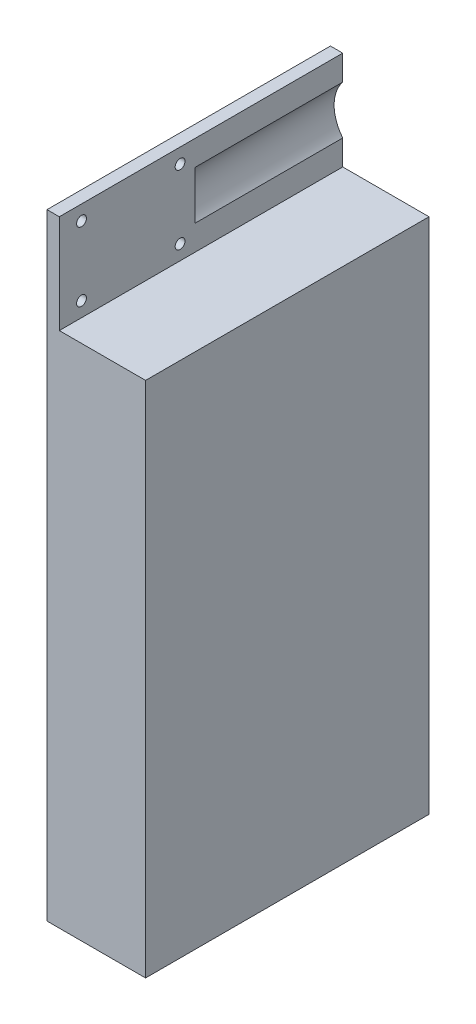
ISO-10303-21;
HEADER;
FILE_DESCRIPTION(('STEP AP214'),'2;1');
FILE_NAME('part.step','',(''),(''),'','','');
FILE_SCHEMA(('AUTOMOTIVE_DESIGN { 1 0 10303 214 1 1 1 1 }'));
ENDSEC;
DATA;
#1=APPLICATION_CONTEXT('core data for automotive mechanical design processes');
#2=APPLICATION_PROTOCOL_DEFINITION('international standard','automotive_design',2000,#1);
#3=PRODUCT_CONTEXT('',#1,'mechanical');
#4=PRODUCT('Part','Part','',(#3));
#5=PRODUCT_RELATED_PRODUCT_CATEGORY('part','',(#4));
#6=PRODUCT_DEFINITION_FORMATION('','',#4);
#7=PRODUCT_DEFINITION_CONTEXT('part definition',#1,'design');
#8=PRODUCT_DEFINITION('design','',#6,#7);
#9=PRODUCT_DEFINITION_SHAPE('','',#8);
#10=(LENGTH_UNIT() NAMED_UNIT(*) SI_UNIT(.MILLI.,.METRE.));
#11=(NAMED_UNIT(*) PLANE_ANGLE_UNIT() SI_UNIT($,.RADIAN.));
#12=(NAMED_UNIT(*) SI_UNIT($,.STERADIAN.) SOLID_ANGLE_UNIT());
#13=UNCERTAINTY_MEASURE_WITH_UNIT(LENGTH_MEASURE(1.E-05),#10,'distance_accuracy_value','');
#14=(GEOMETRIC_REPRESENTATION_CONTEXT(3) GLOBAL_UNCERTAINTY_ASSIGNED_CONTEXT((#13)) GLOBAL_UNIT_ASSIGNED_CONTEXT((#10,
#11,#12)) REPRESENTATION_CONTEXT('',''));
#15=CARTESIAN_POINT('',(0.,0.,0.));
#16=DIRECTION('',(0.,0.,1.));
#17=DIRECTION('',(1.,0.,0.));
#18=AXIS2_PLACEMENT_3D('',#15,#16,#17);
#19=CARTESIAN_POINT('',(0.,0.,115.));
#20=DIRECTION('',(0.,-1.,0.));
#21=DIRECTION('',(0.,0.,-1.));
#22=AXIS2_PLACEMENT_3D('',#19,#20,#21);
#23=PLANE('',#22);
#24=DIRECTION('',(-1.,0.,0.));
#25=VECTOR('',#24,1.);
#26=CARTESIAN_POINT('',(0.,0.,0.));
#27=LINE('',#26,#25);
#28=CARTESIAN_POINT('',(35.,0.,0.));
#29=VERTEX_POINT('',#28);
#30=CARTESIAN_POINT('',(0.,0.,0.));
#31=VERTEX_POINT('',#30);
#32=EDGE_CURVE('E139',#29,#31,#27,.T.);
#33=ORIENTED_EDGE('',*,*,#32,.T.);
#34=DIRECTION('',(0.,0.,-1.));
#35=VECTOR('',#34,1.);
#36=CARTESIAN_POINT('',(0.,0.,115.));
#37=LINE('',#36,#35);
#38=CARTESIAN_POINT('',(0.,0.,115.));
#39=VERTEX_POINT('',#38);
#40=EDGE_CURVE('E170',#39,#31,#37,.T.);
#41=ORIENTED_EDGE('',*,*,#40,.F.);
#42=DIRECTION('',(-1.,0.,0.));
#43=VECTOR('',#42,1.);
#44=CARTESIAN_POINT('',(0.,0.,115.));
#45=LINE('',#44,#43);
#46=CARTESIAN_POINT('',(35.,0.,115.));
#47=VERTEX_POINT('',#46);
#48=EDGE_CURVE('E159',#47,#39,#45,.T.);
#49=ORIENTED_EDGE('',*,*,#48,.F.);
#50=DIRECTION('',(0.,0.,-1.));
#51=VECTOR('',#50,1.);
#52=CARTESIAN_POINT('',(35.,0.,115.));
#53=LINE('',#52,#51);
#54=EDGE_CURVE('E135',#47,#29,#53,.T.);
#55=ORIENTED_EDGE('',*,*,#54,.T.);
#56=EDGE_LOOP('',(#33,#41,#49,#55));
#57=FACE_BOUND('',#56,.T.);
#58=ADVANCED_FACE('F38',(#57),#23,.F.);
#59=CARTESIAN_POINT('',(0.,0.,115.));
#60=DIRECTION('',(-1.,0.,0.));
#61=DIRECTION('',(0.,0.,1.));
#62=AXIS2_PLACEMENT_3D('',#59,#60,#61);
#63=PLANE('',#62);
#64=CARTESIAN_POINT('',(0.,34.,106.));
#65=DIRECTION('',(-1.,0.,0.));
#66=DIRECTION('',(0.,0.,1.));
#67=AXIS2_PLACEMENT_3D('',#64,#65,#66);
#68=CIRCLE('',#67,2.);
#69=CARTESIAN_POINT('',(0.,34.,108.));
#70=VERTEX_POINT('',#69);
#71=EDGE_CURVE('E144',#70,#70,#68,.T.);
#72=ORIENTED_EDGE('',*,*,#71,.T.);
#73=EDGE_LOOP('',(#72));
#74=FACE_BOUND('',#73,.T.);
#75=CARTESIAN_POINT('',(0.,6.00000000000002,66.));
#76=DIRECTION('',(-1.,0.,0.));
#77=DIRECTION('',(0.,0.,1.));
#78=AXIS2_PLACEMENT_3D('',#75,#76,#77);
#79=CIRCLE('',#78,2.);
#80=CARTESIAN_POINT('',(0.,6.00000000000002,68.));
#81=VERTEX_POINT('',#80);
#82=EDGE_CURVE('E196',#81,#81,#79,.T.);
#83=ORIENTED_EDGE('',*,*,#82,.T.);
#84=EDGE_LOOP('',(#83));
#85=FACE_BOUND('',#84,.T.);
#86=CARTESIAN_POINT('',(0.,6.00000000000001,106.));
#87=DIRECTION('',(-1.,0.,0.));
#88=DIRECTION('',(0.,0.,1.));
#89=AXIS2_PLACEMENT_3D('',#86,#87,#88);
#90=CIRCLE('',#89,2.);
#91=CARTESIAN_POINT('',(0.,6.00000000000001,108.));
#92=VERTEX_POINT('',#91);
#93=EDGE_CURVE('E200',#92,#92,#90,.T.);
#94=ORIENTED_EDGE('',*,*,#93,.T.);
#95=EDGE_LOOP('',(#94));
#96=FACE_BOUND('',#95,.T.);
#97=CARTESIAN_POINT('',(0.,34.,66.));
#98=DIRECTION('',(-1.,0.,0.));
#99=DIRECTION('',(0.,0.,1.));
#100=AXIS2_PLACEMENT_3D('',#97,#98,#99);
#101=CIRCLE('',#100,2.);
#102=CARTESIAN_POINT('',(0.,34.,68.));
#103=VERTEX_POINT('',#102);
#104=EDGE_CURVE('E204',#103,#103,#101,.T.);
#105=ORIENTED_EDGE('',*,*,#104,.T.);
#106=EDGE_LOOP('',(#105));
#107=FACE_BOUND('',#106,.T.);
#108=DIRECTION('',(0.,-1.,0.));
#109=VECTOR('',#108,1.);
#110=CARTESIAN_POINT('',(0.,0.,60.));
#111=LINE('',#110,#109);
#112=CARTESIAN_POINT('',(0.,29.8107084351743,60.));
#113=VERTEX_POINT('',#112);
#114=CARTESIAN_POINT('',(0.,10.1892915648257,60.));
#115=VERTEX_POINT('',#114);
#116=EDGE_CURVE('E11',#113,#115,#111,.T.);
#117=ORIENTED_EDGE('',*,*,#116,.F.);
#118=DIRECTION('',(0.,0.,-1.));
#119=VECTOR('',#118,1.);
#120=CARTESIAN_POINT('',(0.,29.8107084351743,60.));
#121=LINE('',#120,#119);
#122=CARTESIAN_POINT('',(0.,29.8107084351743,0.));
#123=VERTEX_POINT('',#122);
#124=EDGE_CURVE('E224',#113,#123,#121,.T.);
#125=ORIENTED_EDGE('',*,*,#124,.T.);
#126=DIRECTION('',(0.,1.,0.));
#127=VECTOR('',#126,1.);
#128=CARTESIAN_POINT('',(0.,0.,0.));
#129=LINE('',#128,#127);
#130=CARTESIAN_POINT('',(0.,40.,0.));
#131=VERTEX_POINT('',#130);
#132=EDGE_CURVE('E143',#123,#131,#129,.T.);
#133=ORIENTED_EDGE('',*,*,#132,.T.);
#134=DIRECTION('',(0.,0.,-1.));
#135=VECTOR('',#134,1.);
#136=CARTESIAN_POINT('',(0.,40.,115.));
#137=LINE('',#136,#135);
#138=CARTESIAN_POINT('',(0.,40.,115.));
#139=VERTEX_POINT('',#138);
#140=EDGE_CURVE('E166',#139,#131,#137,.T.);
#141=ORIENTED_EDGE('',*,*,#140,.F.);
#142=DIRECTION('',(0.,1.,0.));
#143=VECTOR('',#142,1.);
#144=CARTESIAN_POINT('',(0.,0.,115.));
#145=LINE('',#144,#143);
#146=EDGE_CURVE('E98',#39,#139,#145,.T.);
#147=ORIENTED_EDGE('',*,*,#146,.F.);
#148=ORIENTED_EDGE('',*,*,#40,.T.);
#149=CARTESIAN_POINT('',(0.,10.1892915648257,0.));
#150=VERTEX_POINT('',#149);
#151=EDGE_CURVE('E145',#31,#150,#129,.T.);
#152=ORIENTED_EDGE('',*,*,#151,.T.);
#153=DIRECTION('',(0.,0.,-1.));
#154=VECTOR('',#153,1.);
#155=CARTESIAN_POINT('',(0.,10.1892915648257,60.));
#156=LINE('',#155,#154);
#157=EDGE_CURVE('E53',#150,#115,#156,.F.);
#158=ORIENTED_EDGE('',*,*,#157,.T.);
#159=EDGE_LOOP('',(#117,#125,#133,#141,#147,#148,#152,#158));
#160=FACE_BOUND('',#159,.T.);
#161=ADVANCED_FACE('F181',(#74,#85,#96,#107,#160),#63,.F.);
#162=CARTESIAN_POINT('',(0.,40.,115.));
#163=DIRECTION('',(0.,-1.,0.));
#164=DIRECTION('',(0.,0.,-1.));
#165=AXIS2_PLACEMENT_3D('',#162,#163,#164);
#166=PLANE('',#165);
#167=DIRECTION('',(-1.,0.,0.));
#168=VECTOR('',#167,1.);
#169=CARTESIAN_POINT('',(0.,40.,0.));
#170=LINE('',#169,#168);
#171=CARTESIAN_POINT('',(-5.,40.,0.));
#172=VERTEX_POINT('',#171);
#173=EDGE_CURVE('E149',#131,#172,#170,.T.);
#174=ORIENTED_EDGE('',*,*,#173,.T.);
#175=DIRECTION('',(0.,0.,-1.));
#176=VECTOR('',#175,1.);
#177=CARTESIAN_POINT('',(-5.,40.,115.));
#178=LINE('',#177,#176);
#179=CARTESIAN_POINT('',(-5.,40.,115.));
#180=VERTEX_POINT('',#179);
#181=EDGE_CURVE('E128',#180,#172,#178,.T.);
#182=ORIENTED_EDGE('',*,*,#181,.F.);
#183=DIRECTION('',(-1.,0.,0.));
#184=VECTOR('',#183,1.);
#185=CARTESIAN_POINT('',(0.,40.,115.));
#186=LINE('',#185,#184);
#187=EDGE_CURVE('E114',#139,#180,#186,.T.);
#188=ORIENTED_EDGE('',*,*,#187,.F.);
#189=ORIENTED_EDGE('',*,*,#140,.T.);
#190=EDGE_LOOP('',(#174,#182,#188,#189));
#191=FACE_BOUND('',#190,.T.);
#192=ADVANCED_FACE('F250',(#191),#166,.F.);
#193=CARTESIAN_POINT('',(-5.,40.,115.));
#194=DIRECTION('',(1.,0.,0.));
#195=DIRECTION('',(0.,1.,0.));
#196=AXIS2_PLACEMENT_3D('',#193,#194,#195);
#197=PLANE('',#196);
#198=CARTESIAN_POINT('',(-5.,34.,106.));
#199=DIRECTION('',(-1.,0.,0.));
#200=DIRECTION('',(0.,-1.,0.));
#201=AXIS2_PLACEMENT_3D('',#198,#199,#200);
#202=CIRCLE('',#201,2.);
#203=CARTESIAN_POINT('',(-5.,32.,106.));
#204=VERTEX_POINT('',#203);
#205=EDGE_CURVE('E212',#204,#204,#202,.T.);
#206=ORIENTED_EDGE('',*,*,#205,.F.);
#207=EDGE_LOOP('',(#206));
#208=FACE_BOUND('',#207,.T.);
#209=CARTESIAN_POINT('',(-5.,6.00000000000002,66.));
#210=DIRECTION('',(-1.,0.,0.));
#211=DIRECTION('',(0.,1.,0.));
#212=AXIS2_PLACEMENT_3D('',#209,#210,#211);
#213=CIRCLE('',#212,2.);
#214=CARTESIAN_POINT('',(-5.,8.00000000000001,66.));
#215=VERTEX_POINT('',#214);
#216=EDGE_CURVE('E213',#215,#215,#213,.T.);
#217=ORIENTED_EDGE('',*,*,#216,.F.);
#218=EDGE_LOOP('',(#217));
#219=FACE_BOUND('',#218,.T.);
#220=CARTESIAN_POINT('',(-5.,6.,106.));
#221=DIRECTION('',(-1.,0.,0.));
#222=DIRECTION('',(0.,1.,0.));
#223=AXIS2_PLACEMENT_3D('',#220,#221,#222);
#224=CIRCLE('',#223,2.);
#225=CARTESIAN_POINT('',(-5.,8.,106.));
#226=VERTEX_POINT('',#225);
#227=EDGE_CURVE('E217',#226,#226,#224,.T.);
#228=ORIENTED_EDGE('',*,*,#227,.F.);
#229=EDGE_LOOP('',(#228));
#230=FACE_BOUND('',#229,.T.);
#231=CARTESIAN_POINT('',(-5.,34.,66.));
#232=DIRECTION('',(-1.,0.,0.));
#233=DIRECTION('',(0.,-1.,0.));
#234=AXIS2_PLACEMENT_3D('',#231,#232,#233);
#235=CIRCLE('',#234,2.);
#236=CARTESIAN_POINT('',(-5.,32.,66.));
#237=VERTEX_POINT('',#236);
#238=EDGE_CURVE('E208',#237,#237,#235,.T.);
#239=ORIENTED_EDGE('',*,*,#238,.F.);
#240=EDGE_LOOP('',(#239));
#241=FACE_BOUND('',#240,.T.);
#242=DIRECTION('',(0.,-1.,0.));
#243=VECTOR('',#242,1.);
#244=CARTESIAN_POINT('',(-5.,40.,0.));
#245=LINE('',#244,#243);
#246=CARTESIAN_POINT('',(-4.99999999999997,-210.,0.));
#247=VERTEX_POINT('',#246);
#248=EDGE_CURVE('E124',#172,#247,#245,.T.);
#249=ORIENTED_EDGE('',*,*,#248,.T.);
#250=DIRECTION('',(0.,0.,-1.));
#251=VECTOR('',#250,1.);
#252=CARTESIAN_POINT('',(-4.99999999999997,-210.,115.));
#253=LINE('',#252,#251);
#254=CARTESIAN_POINT('',(-4.99999999999997,-210.,115.));
#255=VERTEX_POINT('',#254);
#256=EDGE_CURVE('E121',#255,#247,#253,.T.);
#257=ORIENTED_EDGE('',*,*,#256,.F.);
#258=DIRECTION('',(0.,-1.,0.));
#259=VECTOR('',#258,1.);
#260=CARTESIAN_POINT('',(-5.,40.,115.));
#261=LINE('',#260,#259);
#262=EDGE_CURVE('E107',#180,#255,#261,.T.);
#263=ORIENTED_EDGE('',*,*,#262,.F.);
#264=ORIENTED_EDGE('',*,*,#181,.T.);
#265=EDGE_LOOP('',(#249,#257,#263,#264));
#266=FACE_BOUND('',#265,.T.);
#267=ADVANCED_FACE('F122',(#208,#219,#230,#241,#266),#197,.F.);
#268=CARTESIAN_POINT('',(-4.99999999999997,-210.,115.));
#269=DIRECTION('',(0.,1.,0.));
#270=DIRECTION('',(0.,0.,1.));
#271=AXIS2_PLACEMENT_3D('',#268,#269,#270);
#272=PLANE('',#271);
#273=DIRECTION('',(1.,0.,0.));
#274=VECTOR('',#273,1.);
#275=CARTESIAN_POINT('',(-4.99999999999997,-210.,0.));
#276=LINE('',#275,#274);
#277=CARTESIAN_POINT('',(35.,-210.,0.));
#278=VERTEX_POINT('',#277);
#279=EDGE_CURVE('E154',#247,#278,#276,.T.);
#280=ORIENTED_EDGE('',*,*,#279,.T.);
#281=DIRECTION('',(0.,0.,-1.));
#282=VECTOR('',#281,1.);
#283=CARTESIAN_POINT('',(35.,-210.,115.));
#284=LINE('',#283,#282);
#285=CARTESIAN_POINT('',(35.,-210.,115.));
#286=VERTEX_POINT('',#285);
#287=EDGE_CURVE('E129',#286,#278,#284,.T.);
#288=ORIENTED_EDGE('',*,*,#287,.F.);
#289=DIRECTION('',(1.,0.,0.));
#290=VECTOR('',#289,1.);
#291=CARTESIAN_POINT('',(-4.99999999999997,-210.,115.));
#292=LINE('',#291,#290);
#293=EDGE_CURVE('E111',#255,#286,#292,.T.);
#294=ORIENTED_EDGE('',*,*,#293,.F.);
#295=ORIENTED_EDGE('',*,*,#256,.T.);
#296=EDGE_LOOP('',(#280,#288,#294,#295));
#297=FACE_BOUND('',#296,.T.);
#298=ADVANCED_FACE('F131',(#297),#272,.F.);
#299=CARTESIAN_POINT('',(35.,-210.,115.));
#300=DIRECTION('',(-1.,0.,0.));
#301=DIRECTION('',(0.,0.,1.));
#302=AXIS2_PLACEMENT_3D('',#299,#300,#301);
#303=PLANE('',#302);
#304=DIRECTION('',(0.,1.,0.));
#305=VECTOR('',#304,1.);
#306=CARTESIAN_POINT('',(35.,-210.,0.));
#307=LINE('',#306,#305);
#308=EDGE_CURVE('E89',#278,#29,#307,.T.);
#309=ORIENTED_EDGE('',*,*,#308,.T.);
#310=ORIENTED_EDGE('',*,*,#54,.F.);
#311=DIRECTION('',(0.,1.,0.));
#312=VECTOR('',#311,1.);
#313=CARTESIAN_POINT('',(35.,-210.,115.));
#314=LINE('',#313,#312);
#315=EDGE_CURVE('E62',#286,#47,#314,.T.);
#316=ORIENTED_EDGE('',*,*,#315,.F.);
#317=ORIENTED_EDGE('',*,*,#287,.T.);
#318=EDGE_LOOP('',(#309,#310,#316,#317));
#319=FACE_BOUND('',#318,.T.);
#320=ADVANCED_FACE('F186',(#319),#303,.F.);
#321=CARTESIAN_POINT('',(0.,0.,115.));
#322=DIRECTION('',(0.,0.,1.));
#323=DIRECTION('',(1.,0.,0.));
#324=AXIS2_PLACEMENT_3D('',#321,#322,#323);
#325=PLANE('',#324);
#326=ORIENTED_EDGE('',*,*,#48,.T.);
#327=ORIENTED_EDGE('',*,*,#146,.T.);
#328=ORIENTED_EDGE('',*,*,#187,.T.);
#329=ORIENTED_EDGE('',*,*,#262,.T.);
#330=ORIENTED_EDGE('',*,*,#293,.T.);
#331=ORIENTED_EDGE('',*,*,#315,.T.);
#332=EDGE_LOOP('',(#326,#327,#328,#329,#330,#331));
#333=FACE_BOUND('',#332,.T.);
#334=ADVANCED_FACE('F109',(#333),#325,.T.);
#335=CARTESIAN_POINT('',(0.,0.,0.));
#336=DIRECTION('',(0.,0.,1.));
#337=DIRECTION('',(1.,0.,0.));
#338=AXIS2_PLACEMENT_3D('',#335,#336,#337);
#339=PLANE('',#338);
#340=ORIENTED_EDGE('',*,*,#132,.F.);
#341=CARTESIAN_POINT('',(12.,20.,0.));
#342=DIRECTION('',(0.,0.,1.));
#343=DIRECTION('',(1.,0.,0.));
#344=AXIS2_PLACEMENT_3D('',#341,#342,#343);
#345=CIRCLE('',#344,15.5);
#346=EDGE_CURVE('E46',#123,#150,#345,.T.);
#347=ORIENTED_EDGE('',*,*,#346,.T.);
#348=ORIENTED_EDGE('',*,*,#151,.F.);
#349=ORIENTED_EDGE('',*,*,#32,.F.);
#350=ORIENTED_EDGE('',*,*,#308,.F.);
#351=ORIENTED_EDGE('',*,*,#279,.F.);
#352=ORIENTED_EDGE('',*,*,#248,.F.);
#353=ORIENTED_EDGE('',*,*,#173,.F.);
#354=EDGE_LOOP('',(#340,#347,#348,#349,#350,#351,#352,#353));
#355=FACE_BOUND('',#354,.T.);
#356=ADVANCED_FACE('F175',(#355),#339,.F.);
#357=CARTESIAN_POINT('',(35.,34.,66.));
#358=DIRECTION('',(-1.,0.,0.));
#359=DIRECTION('',(0.,-1.,0.));
#360=AXIS2_PLACEMENT_3D('',#357,#358,#359);
#361=CYLINDRICAL_SURFACE('',#360,2.);
#362=ORIENTED_EDGE('',*,*,#238,.T.);
#363=EDGE_LOOP('',(#362));
#364=FACE_BOUND('',#363,.T.);
#365=ORIENTED_EDGE('',*,*,#104,.F.);
#366=EDGE_LOOP('',(#365));
#367=FACE_BOUND('',#366,.T.);
#368=ADVANCED_FACE('F268',(#364,#367),#361,.F.);
#369=CARTESIAN_POINT('',(35.,6.00000000000001,106.));
#370=DIRECTION('',(-1.,0.,0.));
#371=DIRECTION('',(0.,-1.,0.));
#372=AXIS2_PLACEMENT_3D('',#369,#370,#371);
#373=CYLINDRICAL_SURFACE('',#372,2.);
#374=ORIENTED_EDGE('',*,*,#227,.T.);
#375=EDGE_LOOP('',(#374));
#376=FACE_BOUND('',#375,.T.);
#377=ORIENTED_EDGE('',*,*,#93,.F.);
#378=EDGE_LOOP('',(#377));
#379=FACE_BOUND('',#378,.T.);
#380=ADVANCED_FACE('F273',(#376,#379),#373,.F.);
#381=CARTESIAN_POINT('',(35.,6.00000000000002,66.));
#382=DIRECTION('',(-1.,0.,0.));
#383=DIRECTION('',(0.,-1.,0.));
#384=AXIS2_PLACEMENT_3D('',#381,#382,#383);
#385=CYLINDRICAL_SURFACE('',#384,2.);
#386=ORIENTED_EDGE('',*,*,#216,.T.);
#387=EDGE_LOOP('',(#386));
#388=FACE_BOUND('',#387,.T.);
#389=ORIENTED_EDGE('',*,*,#82,.F.);
#390=EDGE_LOOP('',(#389));
#391=FACE_BOUND('',#390,.T.);
#392=ADVANCED_FACE('F275',(#388,#391),#385,.F.);
#393=CARTESIAN_POINT('',(35.,34.,106.));
#394=DIRECTION('',(-1.,0.,0.));
#395=DIRECTION('',(0.,-1.,0.));
#396=AXIS2_PLACEMENT_3D('',#393,#394,#395);
#397=CYLINDRICAL_SURFACE('',#396,2.);
#398=ORIENTED_EDGE('',*,*,#205,.T.);
#399=EDGE_LOOP('',(#398));
#400=FACE_BOUND('',#399,.T.);
#401=ORIENTED_EDGE('',*,*,#71,.F.);
#402=EDGE_LOOP('',(#401));
#403=FACE_BOUND('',#402,.T.);
#404=ADVANCED_FACE('F242',(#400,#403),#397,.F.);
#405=CARTESIAN_POINT('',(12.,20.,60.));
#406=DIRECTION('',(0.,0.,-1.));
#407=DIRECTION('',(-1.,0.,0.));
#408=AXIS2_PLACEMENT_3D('',#405,#406,#407);
#409=PLANE('',#408);
#410=ORIENTED_EDGE('',*,*,#116,.T.);
#411=CARTESIAN_POINT('',(12.,20.,60.));
#412=DIRECTION('',(0.,0.,-1.));
#413=DIRECTION('',(-1.,0.,0.));
#414=AXIS2_PLACEMENT_3D('',#411,#412,#413);
#415=CIRCLE('',#414,15.5);
#416=EDGE_CURVE('E229',#115,#113,#415,.T.);
#417=ORIENTED_EDGE('',*,*,#416,.T.);
#418=EDGE_LOOP('',(#410,#417));
#419=FACE_BOUND('',#418,.T.);
#420=ADVANCED_FACE('F234',(#419),#409,.T.);
#421=CARTESIAN_POINT('',(12.,20.,60.));
#422=DIRECTION('',(0.,0.,-1.));
#423=DIRECTION('',(-1.,0.,0.));
#424=AXIS2_PLACEMENT_3D('',#421,#422,#423);
#425=CYLINDRICAL_SURFACE('',#424,15.5);
#426=ORIENTED_EDGE('',*,*,#416,.F.);
#427=ORIENTED_EDGE('',*,*,#157,.F.);
#428=ORIENTED_EDGE('',*,*,#346,.F.);
#429=ORIENTED_EDGE('',*,*,#124,.F.);
#430=EDGE_LOOP('',(#426,#427,#428,#429));
#431=FACE_BOUND('',#430,.T.);
#432=ADVANCED_FACE('F236',(#431),#425,.F.);
#433=CLOSED_SHELL('',(#58,#161,#192,#267,#298,#320,#334,#356,#368,#380,#392,#404,#420,#432));
#434=MANIFOLD_SOLID_BREP('B2',#433);
#435=ADVANCED_BREP_SHAPE_REPRESENTATION('',(#18,#434),#14);
#436=SHAPE_DEFINITION_REPRESENTATION(#9,#435);
ENDSEC;
END-ISO-10303-21;
